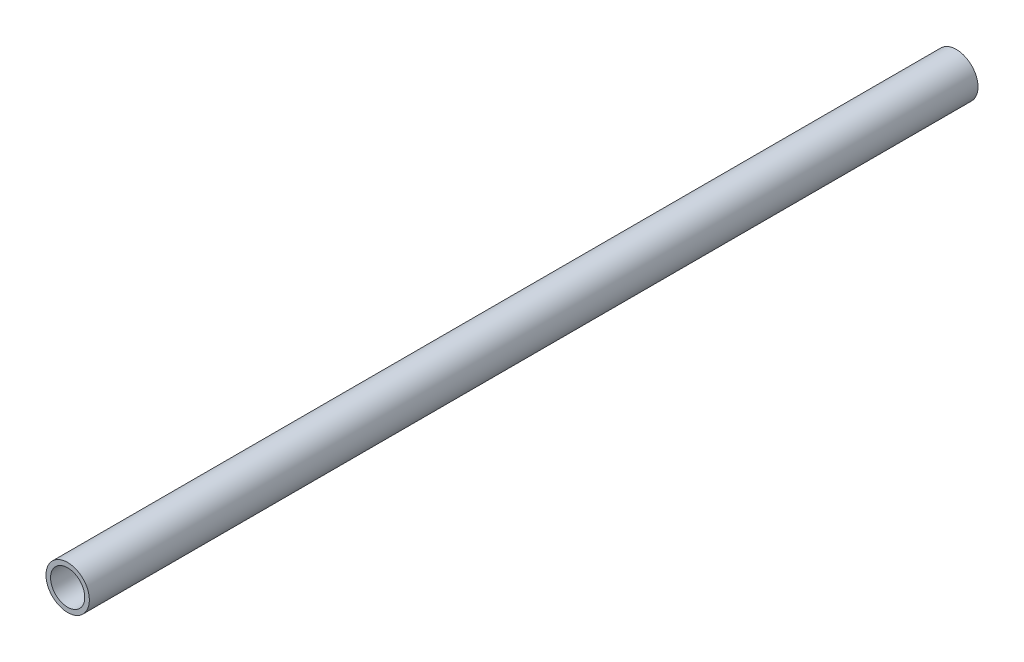
ISO-10303-21;
HEADER;
FILE_DESCRIPTION(('STEP AP214'),'2;1');
FILE_NAME('part.step','',(''),(''),'','','');
FILE_SCHEMA(('AUTOMOTIVE_DESIGN { 1 0 10303 214 1 1 1 1 }'));
ENDSEC;
DATA;
#1=APPLICATION_CONTEXT('core data for automotive mechanical design processes');
#2=APPLICATION_PROTOCOL_DEFINITION('international standard','automotive_design',2000,#1);
#3=PRODUCT_CONTEXT('',#1,'mechanical');
#4=PRODUCT('Part','Part','',(#3));
#5=PRODUCT_RELATED_PRODUCT_CATEGORY('part','',(#4));
#6=PRODUCT_DEFINITION_FORMATION('','',#4);
#7=PRODUCT_DEFINITION_CONTEXT('part definition',#1,'design');
#8=PRODUCT_DEFINITION('design','',#6,#7);
#9=PRODUCT_DEFINITION_SHAPE('','',#8);
#10=(LENGTH_UNIT() NAMED_UNIT(*) SI_UNIT(.MILLI.,.METRE.));
#11=(NAMED_UNIT(*) PLANE_ANGLE_UNIT() SI_UNIT($,.RADIAN.));
#12=(NAMED_UNIT(*) SI_UNIT($,.STERADIAN.) SOLID_ANGLE_UNIT());
#13=UNCERTAINTY_MEASURE_WITH_UNIT(LENGTH_MEASURE(1.E-05),#10,'distance_accuracy_value','');
#14=(GEOMETRIC_REPRESENTATION_CONTEXT(3) GLOBAL_UNCERTAINTY_ASSIGNED_CONTEXT((#13)) GLOBAL_UNIT_ASSIGNED_CONTEXT((#10,
#11,#12)) REPRESENTATION_CONTEXT('',''));
#15=CARTESIAN_POINT('',(0.,0.,0.));
#16=DIRECTION('',(0.,0.,1.));
#17=DIRECTION('',(1.,0.,0.));
#18=AXIS2_PLACEMENT_3D('',#15,#16,#17);
#19=CARTESIAN_POINT('',(0.,0.,130.));
#20=DIRECTION('',(0.,0.,1.));
#21=DIRECTION('',(1.,0.,0.));
#22=AXIS2_PLACEMENT_3D('',#19,#20,#21);
#23=PLANE('',#22);
#24=CARTESIAN_POINT('',(0.,0.,130.));
#25=DIRECTION('',(0.,0.,1.));
#26=DIRECTION('',(1.,0.,0.));
#27=AXIS2_PLACEMENT_3D('',#24,#25,#26);
#28=CIRCLE('',#27,3.175);
#29=CARTESIAN_POINT('',(3.175,0.,130.));
#30=VERTEX_POINT('',#29);
#31=EDGE_CURVE('E10',#30,#30,#28,.T.);
#32=ORIENTED_EDGE('',*,*,#31,.T.);
#33=EDGE_LOOP('',(#32));
#34=FACE_BOUND('',#33,.T.);
#35=CARTESIAN_POINT('',(0.,0.,130.));
#36=DIRECTION('',(0.,0.,1.));
#37=DIRECTION('',(1.,0.,0.));
#38=AXIS2_PLACEMENT_3D('',#35,#36,#37);
#39=CIRCLE('',#38,2.5);
#40=CARTESIAN_POINT('',(2.5,0.,130.));
#41=VERTEX_POINT('',#40);
#42=EDGE_CURVE('E42',#41,#41,#39,.T.);
#43=ORIENTED_EDGE('',*,*,#42,.F.);
#44=EDGE_LOOP('',(#43));
#45=FACE_BOUND('',#44,.T.);
#46=ADVANCED_FACE('F31',(#34,#45),#23,.T.);
#47=CARTESIAN_POINT('',(0.,0.,0.));
#48=DIRECTION('',(0.,0.,1.));
#49=DIRECTION('',(1.,0.,0.));
#50=AXIS2_PLACEMENT_3D('',#47,#48,#49);
#51=PLANE('',#50);
#52=CARTESIAN_POINT('',(0.,0.,0.));
#53=DIRECTION('',(0.,0.,1.));
#54=DIRECTION('',(1.,0.,0.));
#55=AXIS2_PLACEMENT_3D('',#52,#53,#54);
#56=CIRCLE('',#55,3.175);
#57=CARTESIAN_POINT('',(3.175,0.,0.));
#58=VERTEX_POINT('',#57);
#59=EDGE_CURVE('E35',#58,#58,#56,.T.);
#60=ORIENTED_EDGE('',*,*,#59,.F.);
#61=EDGE_LOOP('',(#60));
#62=FACE_BOUND('',#61,.T.);
#63=CARTESIAN_POINT('',(0.,0.,0.));
#64=DIRECTION('',(0.,0.,1.));
#65=DIRECTION('',(1.,0.,0.));
#66=AXIS2_PLACEMENT_3D('',#63,#64,#65);
#67=CIRCLE('',#66,2.5);
#68=CARTESIAN_POINT('',(2.5,0.,0.));
#69=VERTEX_POINT('',#68);
#70=EDGE_CURVE('E44',#69,#69,#67,.T.);
#71=ORIENTED_EDGE('',*,*,#70,.T.);
#72=EDGE_LOOP('',(#71));
#73=FACE_BOUND('',#72,.T.);
#74=ADVANCED_FACE('F54',(#62,#73),#51,.F.);
#75=CARTESIAN_POINT('',(0.,0.,130.));
#76=DIRECTION('',(0.,0.,-1.));
#77=DIRECTION('',(-1.,0.,0.));
#78=AXIS2_PLACEMENT_3D('',#75,#76,#77);
#79=CYLINDRICAL_SURFACE('',#78,3.175);
#80=ORIENTED_EDGE('',*,*,#31,.F.);
#81=EDGE_LOOP('',(#80));
#82=FACE_BOUND('',#81,.T.);
#83=ORIENTED_EDGE('',*,*,#59,.T.);
#84=EDGE_LOOP('',(#83));
#85=FACE_BOUND('',#84,.T.);
#86=ADVANCED_FACE('F33',(#82,#85),#79,.T.);
#87=CARTESIAN_POINT('',(0.,0.,130.));
#88=DIRECTION('',(0.,0.,-1.));
#89=DIRECTION('',(-1.,0.,0.));
#90=AXIS2_PLACEMENT_3D('',#87,#88,#89);
#91=CYLINDRICAL_SURFACE('',#90,2.5);
#92=ORIENTED_EDGE('',*,*,#42,.T.);
#93=EDGE_LOOP('',(#92));
#94=FACE_BOUND('',#93,.T.);
#95=ORIENTED_EDGE('',*,*,#70,.F.);
#96=EDGE_LOOP('',(#95));
#97=FACE_BOUND('',#96,.T.);
#98=ADVANCED_FACE('F50',(#94,#97),#91,.F.);
#99=CLOSED_SHELL('',(#46,#74,#86,#98));
#100=MANIFOLD_SOLID_BREP('B2',#99);
#101=ADVANCED_BREP_SHAPE_REPRESENTATION('',(#18,#100),#14);
#102=SHAPE_DEFINITION_REPRESENTATION(#9,#101);
ENDSEC;
END-ISO-10303-21;
